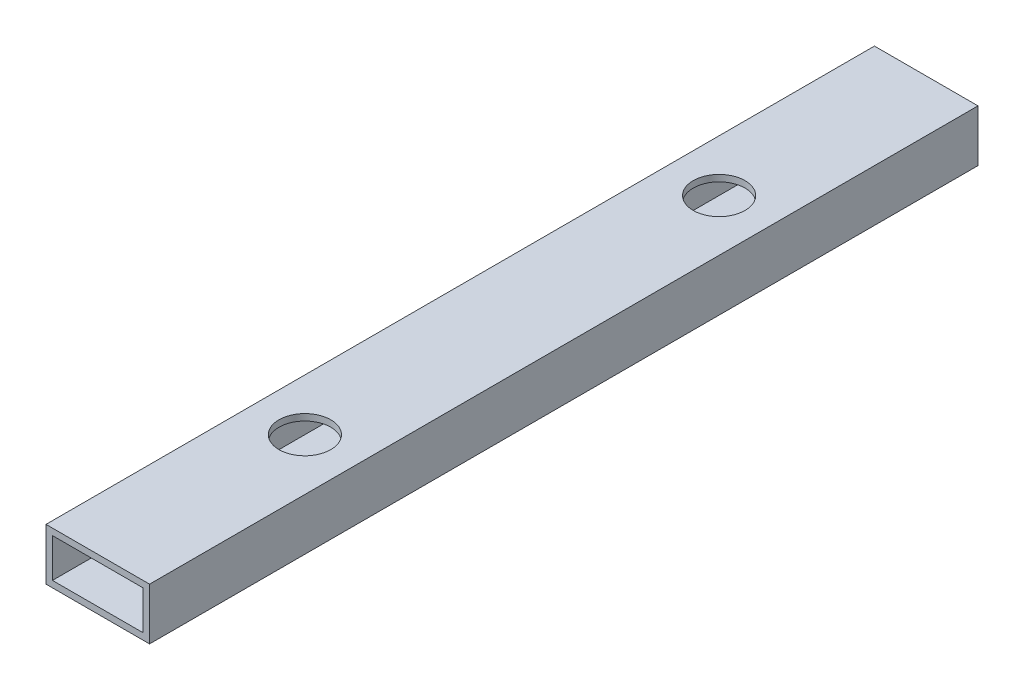
ISO-10303-21;
HEADER;
FILE_DESCRIPTION(('STEP AP214'),'2;1');
FILE_NAME('part.step','',(''),(''),'','','');
FILE_SCHEMA(('AUTOMOTIVE_DESIGN { 1 0 10303 214 1 1 1 1 }'));
ENDSEC;
DATA;
#1=APPLICATION_CONTEXT('core data for automotive mechanical design processes');
#2=APPLICATION_PROTOCOL_DEFINITION('international standard','automotive_design',2000,#1);
#3=PRODUCT_CONTEXT('',#1,'mechanical');
#4=PRODUCT('Part','Part','',(#3));
#5=PRODUCT_RELATED_PRODUCT_CATEGORY('part','',(#4));
#6=PRODUCT_DEFINITION_FORMATION('','',#4);
#7=PRODUCT_DEFINITION_CONTEXT('part definition',#1,'design');
#8=PRODUCT_DEFINITION('design','',#6,#7);
#9=PRODUCT_DEFINITION_SHAPE('','',#8);
#10=(LENGTH_UNIT() NAMED_UNIT(*) SI_UNIT(.MILLI.,.METRE.));
#11=(NAMED_UNIT(*) PLANE_ANGLE_UNIT() SI_UNIT($,.RADIAN.));
#12=(NAMED_UNIT(*) SI_UNIT($,.STERADIAN.) SOLID_ANGLE_UNIT());
#13=UNCERTAINTY_MEASURE_WITH_UNIT(LENGTH_MEASURE(1.E-05),#10,'distance_accuracy_value','');
#14=(GEOMETRIC_REPRESENTATION_CONTEXT(3) GLOBAL_UNCERTAINTY_ASSIGNED_CONTEXT((#13)) GLOBAL_UNIT_ASSIGNED_CONTEXT((#10,
#11,#12)) REPRESENTATION_CONTEXT('',''));
#15=CARTESIAN_POINT('',(0.,0.,0.));
#16=DIRECTION('',(0.,0.,1.));
#17=DIRECTION('',(1.,0.,0.));
#18=AXIS2_PLACEMENT_3D('',#15,#16,#17);
#19=CARTESIAN_POINT('',(0.,0.,406.4));
#20=DIRECTION('',(0.,0.,-1.));
#21=DIRECTION('',(-1.,0.,0.));
#22=AXIS2_PLACEMENT_3D('',#19,#20,#21);
#23=PLANE('',#22);
#24=DIRECTION('',(0.,-1.,0.));
#25=VECTOR('',#24,1.);
#26=CARTESIAN_POINT('',(0.,0.,406.4));
#27=LINE('',#26,#25);
#28=CARTESIAN_POINT('',(0.,25.4,406.4));
#29=VERTEX_POINT('',#28);
#30=CARTESIAN_POINT('',(0.,0.,406.4));
#31=VERTEX_POINT('',#30);
#32=EDGE_CURVE('E156',#29,#31,#27,.T.);
#33=ORIENTED_EDGE('',*,*,#32,.T.);
#34=DIRECTION('',(1.,0.,0.));
#35=VECTOR('',#34,1.);
#36=CARTESIAN_POINT('',(0.,0.,406.4));
#37=LINE('',#36,#35);
#38=CARTESIAN_POINT('',(50.8,0.,406.4));
#39=VERTEX_POINT('',#38);
#40=EDGE_CURVE('E160',#31,#39,#37,.T.);
#41=ORIENTED_EDGE('',*,*,#40,.T.);
#42=DIRECTION('',(0.,1.,0.));
#43=VECTOR('',#42,1.);
#44=CARTESIAN_POINT('',(50.8,0.,406.4));
#45=LINE('',#44,#43);
#46=CARTESIAN_POINT('',(50.8,25.4,406.4));
#47=VERTEX_POINT('',#46);
#48=EDGE_CURVE('E164',#39,#47,#45,.T.);
#49=ORIENTED_EDGE('',*,*,#48,.T.);
#50=DIRECTION('',(-1.,0.,0.));
#51=VECTOR('',#50,1.);
#52=CARTESIAN_POINT('',(0.,25.4,406.4));
#53=LINE('',#52,#51);
#54=EDGE_CURVE('E167',#47,#29,#53,.T.);
#55=ORIENTED_EDGE('',*,*,#54,.T.);
#56=EDGE_LOOP('',(#33,#41,#49,#55));
#57=FACE_BOUND('',#56,.T.);
#58=DIRECTION('',(0.,-1.,0.));
#59=VECTOR('',#58,1.);
#60=CARTESIAN_POINT('',(3.175,22.225,406.4));
#61=LINE('',#60,#59);
#62=CARTESIAN_POINT('',(3.175,22.225,406.4));
#63=VERTEX_POINT('',#62);
#64=CARTESIAN_POINT('',(3.175,3.175,406.4));
#65=VERTEX_POINT('',#64);
#66=EDGE_CURVE('E107',#63,#65,#61,.T.);
#67=ORIENTED_EDGE('',*,*,#66,.F.);
#68=DIRECTION('',(-1.,0.,0.));
#69=VECTOR('',#68,1.);
#70=CARTESIAN_POINT('',(3.175,22.225,406.4));
#71=LINE('',#70,#69);
#72=CARTESIAN_POINT('',(47.625,22.225,406.4));
#73=VERTEX_POINT('',#72);
#74=EDGE_CURVE('E133',#73,#63,#71,.T.);
#75=ORIENTED_EDGE('',*,*,#74,.F.);
#76=DIRECTION('',(0.,1.,0.));
#77=VECTOR('',#76,1.);
#78=CARTESIAN_POINT('',(47.625,22.225,406.4));
#79=LINE('',#78,#77);
#80=CARTESIAN_POINT('',(47.625,3.175,406.4));
#81=VERTEX_POINT('',#80);
#82=EDGE_CURVE('E129',#81,#73,#79,.T.);
#83=ORIENTED_EDGE('',*,*,#82,.F.);
#84=DIRECTION('',(1.,0.,0.));
#85=VECTOR('',#84,1.);
#86=CARTESIAN_POINT('',(3.175,3.175,406.4));
#87=LINE('',#86,#85);
#88=EDGE_CURVE('E116',#65,#81,#87,.T.);
#89=ORIENTED_EDGE('',*,*,#88,.F.);
#90=EDGE_LOOP('',(#67,#75,#83,#89));
#91=FACE_BOUND('',#90,.T.);
#92=ADVANCED_FACE('F39',(#57,#91),#23,.F.);
#93=CARTESIAN_POINT('',(0.,0.,0.));
#94=DIRECTION('',(0.,0.,-1.));
#95=DIRECTION('',(-1.,0.,0.));
#96=AXIS2_PLACEMENT_3D('',#93,#94,#95);
#97=PLANE('',#96);
#98=DIRECTION('',(0.,-1.,0.));
#99=VECTOR('',#98,1.);
#100=CARTESIAN_POINT('',(0.,0.,0.));
#101=LINE('',#100,#99);
#102=CARTESIAN_POINT('',(0.,25.4,0.));
#103=VERTEX_POINT('',#102);
#104=CARTESIAN_POINT('',(0.,0.,0.));
#105=VERTEX_POINT('',#104);
#106=EDGE_CURVE('E125',#103,#105,#101,.T.);
#107=ORIENTED_EDGE('',*,*,#106,.F.);
#108=DIRECTION('',(-1.,0.,0.));
#109=VECTOR('',#108,1.);
#110=CARTESIAN_POINT('',(0.,25.4,0.));
#111=LINE('',#110,#109);
#112=CARTESIAN_POINT('',(50.8,25.4,0.));
#113=VERTEX_POINT('',#112);
#114=EDGE_CURVE('E161',#113,#103,#111,.T.);
#115=ORIENTED_EDGE('',*,*,#114,.F.);
#116=DIRECTION('',(0.,1.,0.));
#117=VECTOR('',#116,1.);
#118=CARTESIAN_POINT('',(50.8,0.,0.));
#119=LINE('',#118,#117);
#120=CARTESIAN_POINT('',(50.8,0.,0.));
#121=VERTEX_POINT('',#120);
#122=EDGE_CURVE('E177',#121,#113,#119,.T.);
#123=ORIENTED_EDGE('',*,*,#122,.F.);
#124=DIRECTION('',(1.,0.,0.));
#125=VECTOR('',#124,1.);
#126=CARTESIAN_POINT('',(0.,0.,0.));
#127=LINE('',#126,#125);
#128=EDGE_CURVE('E174',#105,#121,#127,.T.);
#129=ORIENTED_EDGE('',*,*,#128,.F.);
#130=EDGE_LOOP('',(#107,#115,#123,#129));
#131=FACE_BOUND('',#130,.T.);
#132=DIRECTION('',(-1.,0.,0.));
#133=VECTOR('',#132,1.);
#134=CARTESIAN_POINT('',(3.175,22.225,0.));
#135=LINE('',#134,#133);
#136=CARTESIAN_POINT('',(47.625,22.225,0.));
#137=VERTEX_POINT('',#136);
#138=CARTESIAN_POINT('',(3.175,22.225,0.));
#139=VERTEX_POINT('',#138);
#140=EDGE_CURVE('E117',#137,#139,#135,.T.);
#141=ORIENTED_EDGE('',*,*,#140,.T.);
#142=DIRECTION('',(0.,-1.,0.));
#143=VECTOR('',#142,1.);
#144=CARTESIAN_POINT('',(3.175,22.225,0.));
#145=LINE('',#144,#143);
#146=CARTESIAN_POINT('',(3.175,3.175,0.));
#147=VERTEX_POINT('',#146);
#148=EDGE_CURVE('E65',#139,#147,#145,.T.);
#149=ORIENTED_EDGE('',*,*,#148,.T.);
#150=DIRECTION('',(1.,0.,0.));
#151=VECTOR('',#150,1.);
#152=CARTESIAN_POINT('',(3.175,3.175,0.));
#153=LINE('',#152,#151);
#154=CARTESIAN_POINT('',(47.625,3.175,0.));
#155=VERTEX_POINT('',#154);
#156=EDGE_CURVE('E123',#147,#155,#153,.T.);
#157=ORIENTED_EDGE('',*,*,#156,.T.);
#158=DIRECTION('',(0.,1.,0.));
#159=VECTOR('',#158,1.);
#160=CARTESIAN_POINT('',(47.625,22.225,0.));
#161=LINE('',#160,#159);
#162=EDGE_CURVE('E143',#155,#137,#161,.T.);
#163=ORIENTED_EDGE('',*,*,#162,.T.);
#164=EDGE_LOOP('',(#141,#149,#157,#163));
#165=FACE_BOUND('',#164,.T.);
#166=ADVANCED_FACE('F227',(#131,#165),#97,.T.);
#167=CARTESIAN_POINT('',(0.,0.,406.4));
#168=DIRECTION('',(1.,0.,0.));
#169=DIRECTION('',(0.,1.,0.));
#170=AXIS2_PLACEMENT_3D('',#167,#168,#169);
#171=PLANE('',#170);
#172=ORIENTED_EDGE('',*,*,#106,.T.);
#173=DIRECTION('',(0.,0.,-1.));
#174=VECTOR('',#173,1.);
#175=CARTESIAN_POINT('',(0.,0.,406.4));
#176=LINE('',#175,#174);
#177=EDGE_CURVE('E11',#31,#105,#176,.T.);
#178=ORIENTED_EDGE('',*,*,#177,.F.);
#179=ORIENTED_EDGE('',*,*,#32,.F.);
#180=DIRECTION('',(0.,0.,-1.));
#181=VECTOR('',#180,1.);
#182=CARTESIAN_POINT('',(0.,25.4,406.4));
#183=LINE('',#182,#181);
#184=EDGE_CURVE('E170',#29,#103,#183,.T.);
#185=ORIENTED_EDGE('',*,*,#184,.T.);
#186=EDGE_LOOP('',(#172,#178,#179,#185));
#187=FACE_BOUND('',#186,.T.);
#188=ADVANCED_FACE('F41',(#187),#171,.F.);
#189=CARTESIAN_POINT('',(0.,0.,406.4));
#190=DIRECTION('',(0.,1.,0.));
#191=DIRECTION('',(0.,0.,1.));
#192=AXIS2_PLACEMENT_3D('',#189,#190,#191);
#193=PLANE('',#192);
#194=ORIENTED_EDGE('',*,*,#128,.T.);
#195=DIRECTION('',(0.,0.,-1.));
#196=VECTOR('',#195,1.);
#197=CARTESIAN_POINT('',(50.8,0.,406.4));
#198=LINE('',#197,#196);
#199=EDGE_CURVE('E49',#39,#121,#198,.T.);
#200=ORIENTED_EDGE('',*,*,#199,.F.);
#201=ORIENTED_EDGE('',*,*,#40,.F.);
#202=ORIENTED_EDGE('',*,*,#177,.T.);
#203=EDGE_LOOP('',(#194,#200,#201,#202));
#204=FACE_BOUND('',#203,.T.);
#205=ADVANCED_FACE('F231',(#204),#193,.F.);
#206=CARTESIAN_POINT('',(50.8,0.,406.4));
#207=DIRECTION('',(-1.,0.,0.));
#208=DIRECTION('',(0.,-1.,0.));
#209=AXIS2_PLACEMENT_3D('',#206,#207,#208);
#210=PLANE('',#209);
#211=ORIENTED_EDGE('',*,*,#122,.T.);
#212=DIRECTION('',(0.,0.,-1.));
#213=VECTOR('',#212,1.);
#214=CARTESIAN_POINT('',(50.8,25.4,406.4));
#215=LINE('',#214,#213);
#216=EDGE_CURVE('E185',#47,#113,#215,.T.);
#217=ORIENTED_EDGE('',*,*,#216,.F.);
#218=ORIENTED_EDGE('',*,*,#48,.F.);
#219=ORIENTED_EDGE('',*,*,#199,.T.);
#220=EDGE_LOOP('',(#211,#217,#218,#219));
#221=FACE_BOUND('',#220,.T.);
#222=ADVANCED_FACE('F214',(#221),#210,.F.);
#223=CARTESIAN_POINT('',(0.,25.4,406.4));
#224=DIRECTION('',(0.,-1.,0.));
#225=DIRECTION('',(0.,0.,-1.));
#226=AXIS2_PLACEMENT_3D('',#223,#224,#225);
#227=PLANE('',#226);
#228=CARTESIAN_POINT('',(25.4,25.4,101.6));
#229=DIRECTION('',(0.,1.,0.));
#230=DIRECTION('',(0.,0.,1.));
#231=AXIS2_PLACEMENT_3D('',#228,#229,#230);
#232=CIRCLE('',#231,12.7);
#233=CARTESIAN_POINT('',(25.4,25.4,114.3));
#234=VERTEX_POINT('',#233);
#235=EDGE_CURVE('E194',#234,#234,#232,.T.);
#236=ORIENTED_EDGE('',*,*,#235,.F.);
#237=EDGE_LOOP('',(#236));
#238=FACE_BOUND('',#237,.T.);
#239=CARTESIAN_POINT('',(25.4,25.4,304.8));
#240=DIRECTION('',(0.,1.,0.));
#241=DIRECTION('',(0.,0.,1.));
#242=AXIS2_PLACEMENT_3D('',#239,#240,#241);
#243=CIRCLE('',#242,12.7);
#244=CARTESIAN_POINT('',(25.4,25.4,317.5));
#245=VERTEX_POINT('',#244);
#246=EDGE_CURVE('E201',#245,#245,#243,.T.);
#247=ORIENTED_EDGE('',*,*,#246,.F.);
#248=EDGE_LOOP('',(#247));
#249=FACE_BOUND('',#248,.T.);
#250=ORIENTED_EDGE('',*,*,#114,.T.);
#251=ORIENTED_EDGE('',*,*,#184,.F.);
#252=ORIENTED_EDGE('',*,*,#54,.F.);
#253=ORIENTED_EDGE('',*,*,#216,.T.);
#254=EDGE_LOOP('',(#250,#251,#252,#253));
#255=FACE_BOUND('',#254,.T.);
#256=ADVANCED_FACE('F211',(#238,#249,#255),#227,.F.);
#257=CARTESIAN_POINT('',(3.175,22.225,406.4));
#258=DIRECTION('',(1.,0.,0.));
#259=DIRECTION('',(0.,1.,0.));
#260=AXIS2_PLACEMENT_3D('',#257,#258,#259);
#261=PLANE('',#260);
#262=ORIENTED_EDGE('',*,*,#148,.F.);
#263=DIRECTION('',(0.,0.,-1.));
#264=VECTOR('',#263,1.);
#265=CARTESIAN_POINT('',(3.175,22.225,406.4));
#266=LINE('',#265,#264);
#267=EDGE_CURVE('E111',#63,#139,#266,.T.);
#268=ORIENTED_EDGE('',*,*,#267,.F.);
#269=ORIENTED_EDGE('',*,*,#66,.T.);
#270=DIRECTION('',(0.,0.,-1.));
#271=VECTOR('',#270,1.);
#272=CARTESIAN_POINT('',(3.175,3.175,406.4));
#273=LINE('',#272,#271);
#274=EDGE_CURVE('E110',#65,#147,#273,.T.);
#275=ORIENTED_EDGE('',*,*,#274,.T.);
#276=EDGE_LOOP('',(#262,#268,#269,#275));
#277=FACE_BOUND('',#276,.T.);
#278=ADVANCED_FACE('F109',(#277),#261,.T.);
#279=CARTESIAN_POINT('',(3.175,3.175,406.4));
#280=DIRECTION('',(0.,1.,0.));
#281=DIRECTION('',(0.,0.,1.));
#282=AXIS2_PLACEMENT_3D('',#279,#280,#281);
#283=PLANE('',#282);
#284=ORIENTED_EDGE('',*,*,#156,.F.);
#285=ORIENTED_EDGE('',*,*,#274,.F.);
#286=ORIENTED_EDGE('',*,*,#88,.T.);
#287=DIRECTION('',(0.,0.,-1.));
#288=VECTOR('',#287,1.);
#289=CARTESIAN_POINT('',(47.625,3.175,406.4));
#290=LINE('',#289,#288);
#291=EDGE_CURVE('E126',#81,#155,#290,.T.);
#292=ORIENTED_EDGE('',*,*,#291,.T.);
#293=EDGE_LOOP('',(#284,#285,#286,#292));
#294=FACE_BOUND('',#293,.T.);
#295=ADVANCED_FACE('F120',(#294),#283,.T.);
#296=CARTESIAN_POINT('',(47.625,22.225,406.4));
#297=DIRECTION('',(-1.,0.,0.));
#298=DIRECTION('',(0.,0.,1.));
#299=AXIS2_PLACEMENT_3D('',#296,#297,#298);
#300=PLANE('',#299);
#301=ORIENTED_EDGE('',*,*,#162,.F.);
#302=ORIENTED_EDGE('',*,*,#291,.F.);
#303=ORIENTED_EDGE('',*,*,#82,.T.);
#304=DIRECTION('',(0.,0.,-1.));
#305=VECTOR('',#304,1.);
#306=CARTESIAN_POINT('',(47.625,22.225,406.4));
#307=LINE('',#306,#305);
#308=EDGE_CURVE('E57',#73,#137,#307,.T.);
#309=ORIENTED_EDGE('',*,*,#308,.T.);
#310=EDGE_LOOP('',(#301,#302,#303,#309));
#311=FACE_BOUND('',#310,.T.);
#312=ADVANCED_FACE('F251',(#311),#300,.T.);
#313=CARTESIAN_POINT('',(3.175,22.225,406.4));
#314=DIRECTION('',(0.,-1.,0.));
#315=DIRECTION('',(0.,0.,-1.));
#316=AXIS2_PLACEMENT_3D('',#313,#314,#315);
#317=PLANE('',#316);
#318=CARTESIAN_POINT('',(25.4,22.225,101.6));
#319=DIRECTION('',(0.,-1.,0.));
#320=DIRECTION('',(0.,0.,-1.));
#321=AXIS2_PLACEMENT_3D('',#318,#319,#320);
#322=CIRCLE('',#321,12.7);
#323=CARTESIAN_POINT('',(25.4,22.225,88.9));
#324=VERTEX_POINT('',#323);
#325=EDGE_CURVE('E43',#324,#324,#322,.T.);
#326=ORIENTED_EDGE('',*,*,#325,.F.);
#327=EDGE_LOOP('',(#326));
#328=FACE_BOUND('',#327,.T.);
#329=CARTESIAN_POINT('',(25.4,22.225,304.8));
#330=DIRECTION('',(0.,-1.,0.));
#331=DIRECTION('',(0.,0.,-1.));
#332=AXIS2_PLACEMENT_3D('',#329,#330,#331);
#333=CIRCLE('',#332,12.7);
#334=CARTESIAN_POINT('',(25.4,22.225,292.1));
#335=VERTEX_POINT('',#334);
#336=EDGE_CURVE('E191',#335,#335,#333,.T.);
#337=ORIENTED_EDGE('',*,*,#336,.F.);
#338=EDGE_LOOP('',(#337));
#339=FACE_BOUND('',#338,.T.);
#340=ORIENTED_EDGE('',*,*,#140,.F.);
#341=ORIENTED_EDGE('',*,*,#308,.F.);
#342=ORIENTED_EDGE('',*,*,#74,.T.);
#343=ORIENTED_EDGE('',*,*,#267,.T.);
#344=EDGE_LOOP('',(#340,#341,#342,#343));
#345=FACE_BOUND('',#344,.T.);
#346=ADVANCED_FACE('F254',(#328,#339,#345),#317,.T.);
#347=CARTESIAN_POINT('',(25.4,12.7,304.8));
#348=DIRECTION('',(0.,1.,0.));
#349=DIRECTION('',(0.,0.,1.));
#350=AXIS2_PLACEMENT_3D('',#347,#348,#349);
#351=CYLINDRICAL_SURFACE('',#350,12.7);
#352=ORIENTED_EDGE('',*,*,#336,.T.);
#353=EDGE_LOOP('',(#352));
#354=FACE_BOUND('',#353,.T.);
#355=ORIENTED_EDGE('',*,*,#246,.T.);
#356=EDGE_LOOP('',(#355));
#357=FACE_BOUND('',#356,.T.);
#358=ADVANCED_FACE('F209',(#354,#357),#351,.F.);
#359=CARTESIAN_POINT('',(25.4,12.7,101.6));
#360=DIRECTION('',(0.,1.,0.));
#361=DIRECTION('',(0.,0.,1.));
#362=AXIS2_PLACEMENT_3D('',#359,#360,#361);
#363=CYLINDRICAL_SURFACE('',#362,12.7);
#364=ORIENTED_EDGE('',*,*,#325,.T.);
#365=EDGE_LOOP('',(#364));
#366=FACE_BOUND('',#365,.T.);
#367=ORIENTED_EDGE('',*,*,#235,.T.);
#368=EDGE_LOOP('',(#367));
#369=FACE_BOUND('',#368,.T.);
#370=ADVANCED_FACE('F261',(#366,#369),#363,.F.);
#371=CLOSED_SHELL('',(#92,#166,#188,#205,#222,#256,#278,#295,#312,#346,#358,#370));
#372=MANIFOLD_SOLID_BREP('B2',#371);
#373=ADVANCED_BREP_SHAPE_REPRESENTATION('',(#18,#372),#14);
#374=SHAPE_DEFINITION_REPRESENTATION(#9,#373);
ENDSEC;
END-ISO-10303-21;
